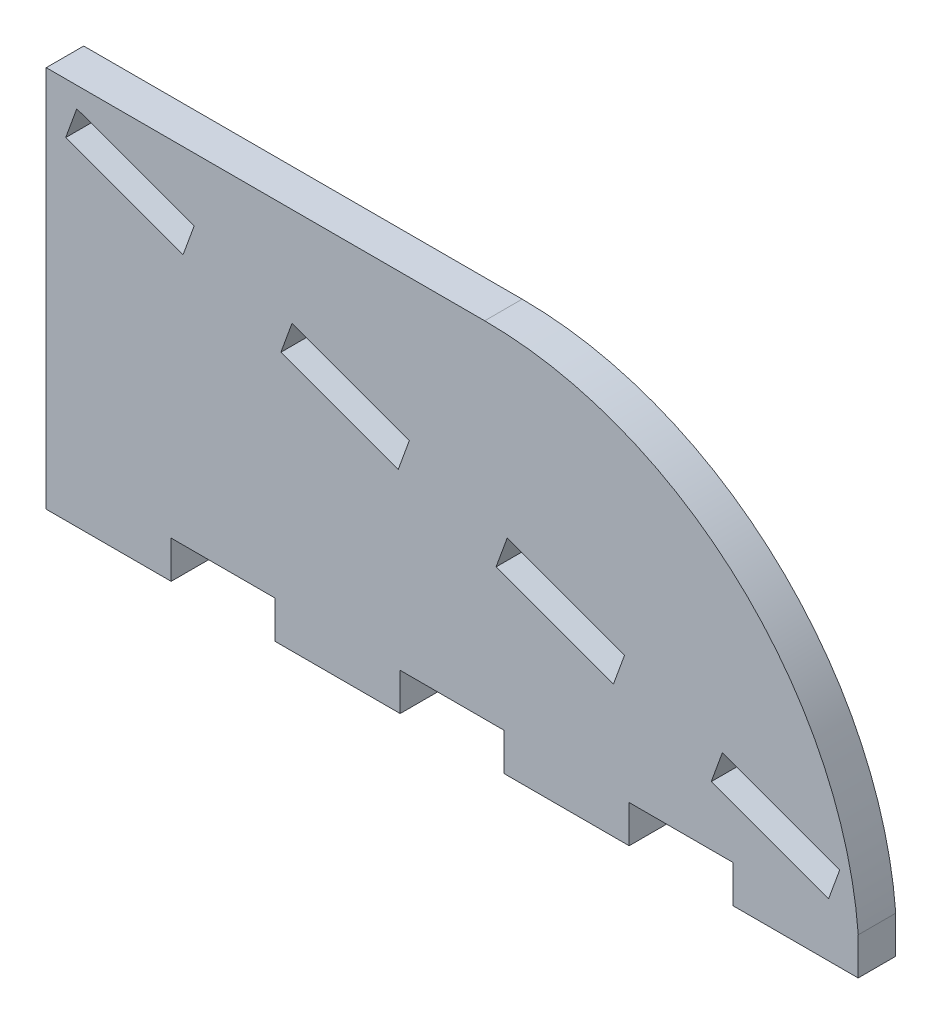
ISO-10303-21;
HEADER;
FILE_DESCRIPTION(('STEP AP214'),'2;1');
FILE_NAME('part.step','',(''),(''),'','','');
FILE_SCHEMA(('AUTOMOTIVE_DESIGN { 1 0 10303 214 1 1 1 1 }'));
ENDSEC;
DATA;
#1=APPLICATION_CONTEXT('core data for automotive mechanical design processes');
#2=APPLICATION_PROTOCOL_DEFINITION('international standard','automotive_design',2000,#1);
#3=PRODUCT_CONTEXT('',#1,'mechanical');
#4=PRODUCT('Part','Part','',(#3));
#5=PRODUCT_RELATED_PRODUCT_CATEGORY('part','',(#4));
#6=PRODUCT_DEFINITION_FORMATION('','',#4);
#7=PRODUCT_DEFINITION_CONTEXT('part definition',#1,'design');
#8=PRODUCT_DEFINITION('design','',#6,#7);
#9=PRODUCT_DEFINITION_SHAPE('','',#8);
#10=(LENGTH_UNIT() NAMED_UNIT(*) SI_UNIT(.MILLI.,.METRE.));
#11=(NAMED_UNIT(*) PLANE_ANGLE_UNIT() SI_UNIT($,.RADIAN.));
#12=(NAMED_UNIT(*) SI_UNIT($,.STERADIAN.) SOLID_ANGLE_UNIT());
#13=UNCERTAINTY_MEASURE_WITH_UNIT(LENGTH_MEASURE(1.E-05),#10,'distance_accuracy_value','');
#14=(GEOMETRIC_REPRESENTATION_CONTEXT(3) GLOBAL_UNCERTAINTY_ASSIGNED_CONTEXT((#13)) GLOBAL_UNIT_ASSIGNED_CONTEXT((#10,
#11,#12)) REPRESENTATION_CONTEXT('',''));
#15=CARTESIAN_POINT('',(0.,0.,0.));
#16=DIRECTION('',(0.,0.,1.));
#17=DIRECTION('',(1.,0.,0.));
#18=AXIS2_PLACEMENT_3D('',#15,#16,#17);
#19=CARTESIAN_POINT('',(0.,0.,3.));
#20=DIRECTION('',(0.,0.,-1.));
#21=DIRECTION('',(-1.,0.,0.));
#22=AXIS2_PLACEMENT_3D('',#19,#20,#21);
#23=PLANE('',#22);
#24=DIRECTION('',(-0.342020143325653,-0.939692620785914,0.));
#25=VECTOR('',#24,1.);
#26=CARTESIAN_POINT('',(-28.9958411960395,11.0002831121149,3.));
#27=LINE('',#26,#25);
#28=CARTESIAN_POINT('',(-28.1065888233928,13.4434839261583,3.));
#29=VERTEX_POINT('',#28);
#30=CARTESIAN_POINT('',(-28.9958411960395,11.0002831121149,3.));
#31=VERTEX_POINT('',#30);
#32=EDGE_CURVE('E294',#29,#31,#27,.T.);
#33=ORIENTED_EDGE('',*,*,#32,.F.);
#34=DIRECTION('',(-0.939692620785913,0.342020143325656,0.));
#35=VECTOR('',#34,1.);
#36=CARTESIAN_POINT('',(-28.1065888233928,13.4434839261583,3.));
#37=LINE('',#36,#35);
#38=CARTESIAN_POINT('',(-18.7096626155336,10.0232824929017,3.));
#39=VERTEX_POINT('',#38);
#40=EDGE_CURVE('E302',#39,#29,#37,.T.);
#41=ORIENTED_EDGE('',*,*,#40,.F.);
#42=DIRECTION('',(0.342020143325655,0.939692620785914,0.));
#43=VECTOR('',#42,1.);
#44=CARTESIAN_POINT('',(-18.7096626155336,10.0232824929017,3.));
#45=LINE('',#44,#43);
#46=CARTESIAN_POINT('',(-19.5989149881803,7.58008167885839,3.));
#47=VERTEX_POINT('',#46);
#48=EDGE_CURVE('E299',#47,#39,#45,.T.);
#49=ORIENTED_EDGE('',*,*,#48,.F.);
#50=DIRECTION('',(0.939692620785914,-0.342020143325653,0.));
#51=VECTOR('',#50,1.);
#52=CARTESIAN_POINT('',(-28.9958411960395,11.0002831121149,3.));
#53=LINE('',#52,#51);
#54=EDGE_CURVE('E296',#31,#47,#53,.T.);
#55=ORIENTED_EDGE('',*,*,#54,.F.);
#56=EDGE_LOOP('',(#33,#41,#49,#55));
#57=FACE_BOUND('',#56,.T.);
#58=DIRECTION('',(0.939692620785914,-0.342020143325653,0.));
#59=VECTOR('',#58,1.);
#60=CARTESIAN_POINT('',(-63.444972674051,23.5387415664335,3.));
#61=LINE('',#60,#59);
#62=CARTESIAN_POINT('',(-63.444972674051,23.5387415664335,3.));
#63=VERTEX_POINT('',#62);
#64=CARTESIAN_POINT('',(-54.0480464661919,20.118540133177,3.));
#65=VERTEX_POINT('',#64);
#66=EDGE_CURVE('E356',#63,#65,#61,.T.);
#67=ORIENTED_EDGE('',*,*,#66,.F.);
#68=DIRECTION('',(-0.342020143325653,-0.939692620785914,0.));
#69=VECTOR('',#68,1.);
#70=CARTESIAN_POINT('',(-63.444972674051,23.5387415664335,3.));
#71=LINE('',#70,#69);
#72=CARTESIAN_POINT('',(-62.5557203014043,25.9819423804769,3.));
#73=VERTEX_POINT('',#72);
#74=EDGE_CURVE('E364',#73,#63,#71,.T.);
#75=ORIENTED_EDGE('',*,*,#74,.F.);
#76=DIRECTION('',(-0.939692620785915,0.342020143325651,0.));
#77=VECTOR('',#76,1.);
#78=CARTESIAN_POINT('',(-62.5557203014043,25.9819423804769,3.));
#79=LINE('',#78,#77);
#80=CARTESIAN_POINT('',(-53.1587940935452,22.5617409472204,3.));
#81=VERTEX_POINT('',#80);
#82=EDGE_CURVE('E361',#81,#73,#79,.T.);
#83=ORIENTED_EDGE('',*,*,#82,.F.);
#84=DIRECTION('',(0.342020143325651,0.939692620785915,0.));
#85=VECTOR('',#84,1.);
#86=CARTESIAN_POINT('',(-53.1587940935452,22.5617409472204,3.));
#87=LINE('',#86,#85);
#88=EDGE_CURVE('E358',#65,#81,#87,.T.);
#89=ORIENTED_EDGE('',*,*,#88,.F.);
#90=EDGE_LOOP('',(#67,#75,#83,#89));
#91=FACE_BOUND('',#90,.T.);
#92=DIRECTION('',(1.,7.96020419445536E-13,0.));
#93=VECTOR('',#92,1.);
#94=CARTESIAN_POINT('',(0.,0.,3.));
#95=LINE('',#94,#93);
#96=CARTESIAN_POINT('',(-0.0100000000000031,0.,3.));
#97=VERTEX_POINT('',#96);
#98=CARTESIAN_POINT('',(0.,0.,3.));
#99=VERTEX_POINT('',#98);
#100=EDGE_CURVE('E420',#97,#99,#95,.T.);
#101=ORIENTED_EDGE('',*,*,#100,.T.);
#102=CARTESIAN_POINT('',(-29.9048115444083,-2.38793770719092,3.));
#103=DIRECTION('',(0.,0.,-1.));
#104=DIRECTION('',(-1.,0.,0.));
#105=AXIS2_PLACEMENT_3D('',#102,#103,#104);
#106=CIRCLE('',#105,30.);
#107=CARTESIAN_POINT('',(-29.9048115444083,27.6120622928091,3.));
#108=VERTEX_POINT('',#107);
#109=EDGE_CURVE('E11',#99,#108,#106,.F.);
#110=ORIENTED_EDGE('',*,*,#109,.T.);
#111=DIRECTION('',(-1.,0.,0.));
#112=VECTOR('',#111,1.);
#113=CARTESIAN_POINT('',(-65.,27.6120622928091,3.));
#114=LINE('',#113,#112);
#115=CARTESIAN_POINT('',(-65.,27.6120622928091,3.));
#116=VERTEX_POINT('',#115);
#117=EDGE_CURVE('E387',#108,#116,#114,.T.);
#118=ORIENTED_EDGE('',*,*,#117,.T.);
#119=DIRECTION('',(0.,-1.,0.));
#120=VECTOR('',#119,1.);
#121=CARTESIAN_POINT('',(-65.,0.,3.));
#122=LINE('',#121,#120);
#123=CARTESIAN_POINT('',(-65.,-3.00000000000001,3.));
#124=VERTEX_POINT('',#123);
#125=EDGE_CURVE('E389',#116,#124,#122,.T.);
#126=ORIENTED_EDGE('',*,*,#125,.T.);
#127=DIRECTION('',(1.,0.,0.));
#128=VECTOR('',#127,1.);
#129=CARTESIAN_POINT('',(-65.,-3.00000000000001,3.));
#130=LINE('',#129,#128);
#131=CARTESIAN_POINT('',(-55.,-3.00000000000001,3.));
#132=VERTEX_POINT('',#131);
#133=EDGE_CURVE('E392',#124,#132,#130,.T.);
#134=ORIENTED_EDGE('',*,*,#133,.T.);
#135=DIRECTION('',(0.,1.,0.));
#136=VECTOR('',#135,1.);
#137=CARTESIAN_POINT('',(-55.,0.,3.));
#138=LINE('',#137,#136);
#139=CARTESIAN_POINT('',(-55.,0.,3.));
#140=VERTEX_POINT('',#139);
#141=EDGE_CURVE('E394',#132,#140,#138,.T.);
#142=ORIENTED_EDGE('',*,*,#141,.T.);
#143=DIRECTION('',(1.,0.,0.));
#144=VECTOR('',#143,1.);
#145=CARTESIAN_POINT('',(-46.67,0.,3.));
#146=LINE('',#145,#144);
#147=CARTESIAN_POINT('',(-46.67,0.,3.));
#148=VERTEX_POINT('',#147);
#149=EDGE_CURVE('E396',#140,#148,#146,.T.);
#150=ORIENTED_EDGE('',*,*,#149,.T.);
#151=DIRECTION('',(0.,-1.,0.));
#152=VECTOR('',#151,1.);
#153=CARTESIAN_POINT('',(-46.67,0.,3.));
#154=LINE('',#153,#152);
#155=CARTESIAN_POINT('',(-46.67,-3.00000000000001,3.));
#156=VERTEX_POINT('',#155);
#157=EDGE_CURVE('E398',#148,#156,#154,.T.);
#158=ORIENTED_EDGE('',*,*,#157,.T.);
#159=DIRECTION('',(1.,0.,0.));
#160=VECTOR('',#159,1.);
#161=CARTESIAN_POINT('',(-46.67,-3.00000000000001,3.));
#162=LINE('',#161,#160);
#163=CARTESIAN_POINT('',(-36.67,-3.00000000000001,3.));
#164=VERTEX_POINT('',#163);
#165=EDGE_CURVE('E400',#156,#164,#162,.T.);
#166=ORIENTED_EDGE('',*,*,#165,.T.);
#167=DIRECTION('',(0.,1.,0.));
#168=VECTOR('',#167,1.);
#169=CARTESIAN_POINT('',(-36.67,0.,3.));
#170=LINE('',#169,#168);
#171=CARTESIAN_POINT('',(-36.67,0.,3.));
#172=VERTEX_POINT('',#171);
#173=EDGE_CURVE('E402',#164,#172,#170,.T.);
#174=ORIENTED_EDGE('',*,*,#173,.T.);
#175=DIRECTION('',(1.,0.,0.));
#176=VECTOR('',#175,1.);
#177=CARTESIAN_POINT('',(-28.34,0.,3.));
#178=LINE('',#177,#176);
#179=CARTESIAN_POINT('',(-28.34,0.,3.));
#180=VERTEX_POINT('',#179);
#181=EDGE_CURVE('E404',#172,#180,#178,.T.);
#182=ORIENTED_EDGE('',*,*,#181,.T.);
#183=DIRECTION('',(0.,-1.,0.));
#184=VECTOR('',#183,1.);
#185=CARTESIAN_POINT('',(-28.34,0.,3.));
#186=LINE('',#185,#184);
#187=CARTESIAN_POINT('',(-28.34,-3.00000000000001,3.));
#188=VERTEX_POINT('',#187);
#189=EDGE_CURVE('E406',#180,#188,#186,.T.);
#190=ORIENTED_EDGE('',*,*,#189,.T.);
#191=DIRECTION('',(1.,0.,0.));
#192=VECTOR('',#191,1.);
#193=CARTESIAN_POINT('',(-28.34,-3.00000000000001,3.));
#194=LINE('',#193,#192);
#195=CARTESIAN_POINT('',(-18.34,-3.00000000000001,3.));
#196=VERTEX_POINT('',#195);
#197=EDGE_CURVE('E408',#188,#196,#194,.T.);
#198=ORIENTED_EDGE('',*,*,#197,.T.);
#199=DIRECTION('',(0.,1.,0.));
#200=VECTOR('',#199,1.);
#201=CARTESIAN_POINT('',(-18.34,0.,3.));
#202=LINE('',#201,#200);
#203=CARTESIAN_POINT('',(-18.34,0.,3.));
#204=VERTEX_POINT('',#203);
#205=EDGE_CURVE('E410',#196,#204,#202,.T.);
#206=ORIENTED_EDGE('',*,*,#205,.T.);
#207=DIRECTION('',(1.,0.,0.));
#208=VECTOR('',#207,1.);
#209=CARTESIAN_POINT('',(-10.01,0.,3.));
#210=LINE('',#209,#208);
#211=CARTESIAN_POINT('',(-10.01,0.,3.));
#212=VERTEX_POINT('',#211);
#213=EDGE_CURVE('E412',#204,#212,#210,.T.);
#214=ORIENTED_EDGE('',*,*,#213,.T.);
#215=DIRECTION('',(0.,-1.,0.));
#216=VECTOR('',#215,1.);
#217=CARTESIAN_POINT('',(-10.01,0.,3.));
#218=LINE('',#217,#216);
#219=CARTESIAN_POINT('',(-10.01,-3.00000000000001,3.));
#220=VERTEX_POINT('',#219);
#221=EDGE_CURVE('E414',#212,#220,#218,.T.);
#222=ORIENTED_EDGE('',*,*,#221,.T.);
#223=DIRECTION('',(1.,0.,0.));
#224=VECTOR('',#223,1.);
#225=CARTESIAN_POINT('',(-10.01,-3.00000000000001,3.));
#226=LINE('',#225,#224);
#227=CARTESIAN_POINT('',(-0.0100000000000031,-3.00000000000001,3.));
#228=VERTEX_POINT('',#227);
#229=EDGE_CURVE('E416',#220,#228,#226,.T.);
#230=ORIENTED_EDGE('',*,*,#229,.T.);
#231=DIRECTION('',(0.,1.,0.));
#232=VECTOR('',#231,1.);
#233=CARTESIAN_POINT('',(-0.0100000000000031,0.,3.));
#234=LINE('',#233,#232);
#235=EDGE_CURVE('E418',#228,#97,#234,.T.);
#236=ORIENTED_EDGE('',*,*,#235,.T.);
#237=EDGE_LOOP('',(#101,#110,#118,#126,#134,#142,#150,#158,#166,#174,#182,#190,#198,#206,#214,
#222,#230,#236));
#238=FACE_BOUND('',#237,.T.);
#239=DIRECTION('',(-0.342020143325653,-0.939692620785914,0.));
#240=VECTOR('',#239,1.);
#241=CARTESIAN_POINT('',(-46.2204069350453,17.2695123392742,3.));
#242=LINE('',#241,#240);
#243=CARTESIAN_POINT('',(-45.3311545623986,19.7127131533176,3.));
#244=VERTEX_POINT('',#243);
#245=CARTESIAN_POINT('',(-46.2204069350453,17.2695123392742,3.));
#246=VERTEX_POINT('',#245);
#247=EDGE_CURVE('E325',#244,#246,#242,.T.);
#248=ORIENTED_EDGE('',*,*,#247,.F.);
#249=DIRECTION('',(-0.939692620785913,0.342020143325656,0.));
#250=VECTOR('',#249,1.);
#251=CARTESIAN_POINT('',(-45.3311545623986,19.7127131533176,3.));
#252=LINE('',#251,#250);
#253=CARTESIAN_POINT('',(-35.9342283545394,16.292511720061,3.));
#254=VERTEX_POINT('',#253);
#255=EDGE_CURVE('E333',#254,#244,#252,.T.);
#256=ORIENTED_EDGE('',*,*,#255,.F.);
#257=DIRECTION('',(0.342020143325657,0.939692620785913,0.));
#258=VECTOR('',#257,1.);
#259=CARTESIAN_POINT('',(-35.9342283545394,16.292511720061,3.));
#260=LINE('',#259,#258);
#261=CARTESIAN_POINT('',(-36.8234807271861,13.8493109060177,3.));
#262=VERTEX_POINT('',#261);
#263=EDGE_CURVE('E330',#262,#254,#260,.T.);
#264=ORIENTED_EDGE('',*,*,#263,.F.);
#265=DIRECTION('',(0.939692620785914,-0.342020143325653,0.));
#266=VECTOR('',#265,1.);
#267=CARTESIAN_POINT('',(-46.2204069350453,17.2695123392742,3.));
#268=LINE('',#267,#266);
#269=EDGE_CURVE('E327',#246,#262,#268,.T.);
#270=ORIENTED_EDGE('',*,*,#269,.F.);
#271=EDGE_LOOP('',(#248,#256,#264,#270));
#272=FACE_BOUND('',#271,.T.);
#273=DIRECTION('',(-0.342020143325653,-0.939692620785914,0.));
#274=VECTOR('',#273,1.);
#275=CARTESIAN_POINT('',(-11.7712754570337,4.73105388495563,3.));
#276=LINE('',#275,#274);
#277=CARTESIAN_POINT('',(-10.882023084387,7.17425469899901,3.));
#278=VERTEX_POINT('',#277);
#279=CARTESIAN_POINT('',(-11.7712754570337,4.73105388495563,3.));
#280=VERTEX_POINT('',#279);
#281=EDGE_CURVE('E253',#278,#280,#276,.T.);
#282=ORIENTED_EDGE('',*,*,#281,.F.);
#283=DIRECTION('',(-0.939692620785913,0.342020143325656,0.));
#284=VECTOR('',#283,1.);
#285=CARTESIAN_POINT('',(-10.882023084387,7.17425469899901,3.));
#286=LINE('',#285,#284);
#287=CARTESIAN_POINT('',(-1.48509687652787,3.75405326574244,3.));
#288=VERTEX_POINT('',#287);
#289=EDGE_CURVE('E278',#288,#278,#286,.T.);
#290=ORIENTED_EDGE('',*,*,#289,.F.);
#291=DIRECTION('',(0.342020143325655,0.939692620785914,0.));
#292=VECTOR('',#291,1.);
#293=CARTESIAN_POINT('',(-1.48509687652787,3.75405326574244,3.));
#294=LINE('',#293,#292);
#295=CARTESIAN_POINT('',(-2.37434924917456,1.3108524516991,3.));
#296=VERTEX_POINT('',#295);
#297=EDGE_CURVE('E276',#296,#288,#294,.T.);
#298=ORIENTED_EDGE('',*,*,#297,.F.);
#299=DIRECTION('',(0.939692620785914,-0.342020143325653,0.));
#300=VECTOR('',#299,1.);
#301=CARTESIAN_POINT('',(-11.7712754570337,4.73105388495563,3.));
#302=LINE('',#301,#300);
#303=EDGE_CURVE('E263',#280,#296,#302,.T.);
#304=ORIENTED_EDGE('',*,*,#303,.F.);
#305=EDGE_LOOP('',(#282,#290,#298,#304));
#306=FACE_BOUND('',#305,.T.);
#307=ADVANCED_FACE('F33',(#57,#91,#238,#272,#306),#23,.F.);
#308=CARTESIAN_POINT('',(0.,0.,0.));
#309=DIRECTION('',(0.,0.,-1.));
#310=DIRECTION('',(-1.,0.,0.));
#311=AXIS2_PLACEMENT_3D('',#308,#309,#310);
#312=PLANE('',#311);
#313=DIRECTION('',(-0.939692620785913,0.342020143325656,0.));
#314=VECTOR('',#313,1.);
#315=CARTESIAN_POINT('',(-28.1065888233928,13.4434839261583,0.));
#316=LINE('',#315,#314);
#317=CARTESIAN_POINT('',(-18.7096626155336,10.0232824929017,0.));
#318=VERTEX_POINT('',#317);
#319=CARTESIAN_POINT('',(-28.1065888233928,13.4434839261583,0.));
#320=VERTEX_POINT('',#319);
#321=EDGE_CURVE('E297',#318,#320,#316,.T.);
#322=ORIENTED_EDGE('',*,*,#321,.T.);
#323=DIRECTION('',(-0.342020143325653,-0.939692620785914,0.));
#324=VECTOR('',#323,1.);
#325=CARTESIAN_POINT('',(-28.9958411960395,11.0002831121149,0.));
#326=LINE('',#325,#324);
#327=CARTESIAN_POINT('',(-28.9958411960395,11.0002831121149,0.));
#328=VERTEX_POINT('',#327);
#329=EDGE_CURVE('E271',#320,#328,#326,.T.);
#330=ORIENTED_EDGE('',*,*,#329,.T.);
#331=DIRECTION('',(0.939692620785914,-0.342020143325653,0.));
#332=VECTOR('',#331,1.);
#333=CARTESIAN_POINT('',(-28.9958411960395,11.0002831121149,0.));
#334=LINE('',#333,#332);
#335=CARTESIAN_POINT('',(-19.5989149881803,7.58008167885839,0.));
#336=VERTEX_POINT('',#335);
#337=EDGE_CURVE('E307',#328,#336,#334,.T.);
#338=ORIENTED_EDGE('',*,*,#337,.T.);
#339=DIRECTION('',(0.342020143325655,0.939692620785914,0.));
#340=VECTOR('',#339,1.);
#341=CARTESIAN_POINT('',(-18.7096626155336,10.0232824929017,0.));
#342=LINE('',#341,#340);
#343=EDGE_CURVE('E310',#336,#318,#342,.T.);
#344=ORIENTED_EDGE('',*,*,#343,.T.);
#345=EDGE_LOOP('',(#322,#330,#338,#344));
#346=FACE_BOUND('',#345,.T.);
#347=DIRECTION('',(-0.342020143325653,-0.939692620785914,0.));
#348=VECTOR('',#347,1.);
#349=CARTESIAN_POINT('',(-63.444972674051,23.5387415664335,0.));
#350=LINE('',#349,#348);
#351=CARTESIAN_POINT('',(-62.5557203014043,25.9819423804769,0.));
#352=VERTEX_POINT('',#351);
#353=CARTESIAN_POINT('',(-63.444972674051,23.5387415664335,0.));
#354=VERTEX_POINT('',#353);
#355=EDGE_CURVE('E359',#352,#354,#350,.T.);
#356=ORIENTED_EDGE('',*,*,#355,.T.);
#357=DIRECTION('',(0.939692620785914,-0.342020143325653,0.));
#358=VECTOR('',#357,1.);
#359=CARTESIAN_POINT('',(-63.444972674051,23.5387415664335,0.));
#360=LINE('',#359,#358);
#361=CARTESIAN_POINT('',(-54.0480464661919,20.118540133177,0.));
#362=VERTEX_POINT('',#361);
#363=EDGE_CURVE('E355',#354,#362,#360,.T.);
#364=ORIENTED_EDGE('',*,*,#363,.T.);
#365=DIRECTION('',(0.342020143325651,0.939692620785915,0.));
#366=VECTOR('',#365,1.);
#367=CARTESIAN_POINT('',(-53.1587940935452,22.5617409472204,0.));
#368=LINE('',#367,#366);
#369=CARTESIAN_POINT('',(-53.1587940935452,22.5617409472204,0.));
#370=VERTEX_POINT('',#369);
#371=EDGE_CURVE('E369',#362,#370,#368,.T.);
#372=ORIENTED_EDGE('',*,*,#371,.T.);
#373=DIRECTION('',(-0.939692620785915,0.342020143325651,0.));
#374=VECTOR('',#373,1.);
#375=CARTESIAN_POINT('',(-62.5557203014043,25.9819423804769,0.));
#376=LINE('',#375,#374);
#377=EDGE_CURVE('E372',#370,#352,#376,.T.);
#378=ORIENTED_EDGE('',*,*,#377,.T.);
#379=EDGE_LOOP('',(#356,#364,#372,#378));
#380=FACE_BOUND('',#379,.T.);
#381=DIRECTION('',(-1.,0.,0.));
#382=VECTOR('',#381,1.);
#383=CARTESIAN_POINT('',(-65.,27.6120622928091,0.));
#384=LINE('',#383,#382);
#385=CARTESIAN_POINT('',(-29.9048115444083,27.6120622928091,0.));
#386=VERTEX_POINT('',#385);
#387=CARTESIAN_POINT('',(-65.,27.6120622928091,0.));
#388=VERTEX_POINT('',#387);
#389=EDGE_CURVE('E386',#386,#388,#384,.T.);
#390=ORIENTED_EDGE('',*,*,#389,.F.);
#391=CARTESIAN_POINT('',(-29.9048115444083,-2.38793770719092,0.));
#392=DIRECTION('',(0.,0.,-1.));
#393=DIRECTION('',(-1.,0.,0.));
#394=AXIS2_PLACEMENT_3D('',#391,#392,#393);
#395=CIRCLE('',#394,30.);
#396=CARTESIAN_POINT('',(0.,0.,0.));
#397=VERTEX_POINT('',#396);
#398=EDGE_CURVE('E41',#386,#397,#395,.T.);
#399=ORIENTED_EDGE('',*,*,#398,.T.);
#400=DIRECTION('',(1.,7.96020419445536E-13,0.));
#401=VECTOR('',#400,1.);
#402=CARTESIAN_POINT('',(0.,0.,0.));
#403=LINE('',#402,#401);
#404=CARTESIAN_POINT('',(-0.0100000000000031,0.,0.));
#405=VERTEX_POINT('',#404);
#406=EDGE_CURVE('E390',#405,#397,#403,.T.);
#407=ORIENTED_EDGE('',*,*,#406,.F.);
#408=DIRECTION('',(0.,1.,0.));
#409=VECTOR('',#408,1.);
#410=CARTESIAN_POINT('',(-0.0100000000000031,0.,0.));
#411=LINE('',#410,#409);
#412=CARTESIAN_POINT('',(-0.0100000000000031,-3.00000000000001,0.));
#413=VERTEX_POINT('',#412);
#414=EDGE_CURVE('E452',#413,#405,#411,.T.);
#415=ORIENTED_EDGE('',*,*,#414,.F.);
#416=DIRECTION('',(1.,0.,0.));
#417=VECTOR('',#416,1.);
#418=CARTESIAN_POINT('',(-10.01,-3.00000000000001,0.));
#419=LINE('',#418,#417);
#420=CARTESIAN_POINT('',(-10.01,-3.00000000000001,0.));
#421=VERTEX_POINT('',#420);
#422=EDGE_CURVE('E450',#421,#413,#419,.T.);
#423=ORIENTED_EDGE('',*,*,#422,.F.);
#424=DIRECTION('',(0.,-1.,0.));
#425=VECTOR('',#424,1.);
#426=CARTESIAN_POINT('',(-10.01,0.,0.));
#427=LINE('',#426,#425);
#428=CARTESIAN_POINT('',(-10.01,0.,0.));
#429=VERTEX_POINT('',#428);
#430=EDGE_CURVE('E448',#429,#421,#427,.T.);
#431=ORIENTED_EDGE('',*,*,#430,.F.);
#432=DIRECTION('',(1.,0.,0.));
#433=VECTOR('',#432,1.);
#434=CARTESIAN_POINT('',(-10.01,0.,0.));
#435=LINE('',#434,#433);
#436=CARTESIAN_POINT('',(-18.34,0.,0.));
#437=VERTEX_POINT('',#436);
#438=EDGE_CURVE('E446',#437,#429,#435,.T.);
#439=ORIENTED_EDGE('',*,*,#438,.F.);
#440=DIRECTION('',(0.,1.,0.));
#441=VECTOR('',#440,1.);
#442=CARTESIAN_POINT('',(-18.34,0.,0.));
#443=LINE('',#442,#441);
#444=CARTESIAN_POINT('',(-18.34,-3.00000000000001,0.));
#445=VERTEX_POINT('',#444);
#446=EDGE_CURVE('E444',#445,#437,#443,.T.);
#447=ORIENTED_EDGE('',*,*,#446,.F.);
#448=DIRECTION('',(1.,0.,0.));
#449=VECTOR('',#448,1.);
#450=CARTESIAN_POINT('',(-28.34,-3.00000000000001,0.));
#451=LINE('',#450,#449);
#452=CARTESIAN_POINT('',(-28.34,-3.00000000000001,0.));
#453=VERTEX_POINT('',#452);
#454=EDGE_CURVE('E442',#453,#445,#451,.T.);
#455=ORIENTED_EDGE('',*,*,#454,.F.);
#456=DIRECTION('',(0.,-1.,0.));
#457=VECTOR('',#456,1.);
#458=CARTESIAN_POINT('',(-28.34,0.,0.));
#459=LINE('',#458,#457);
#460=CARTESIAN_POINT('',(-28.34,0.,0.));
#461=VERTEX_POINT('',#460);
#462=EDGE_CURVE('E440',#461,#453,#459,.T.);
#463=ORIENTED_EDGE('',*,*,#462,.F.);
#464=DIRECTION('',(1.,0.,0.));
#465=VECTOR('',#464,1.);
#466=CARTESIAN_POINT('',(-28.34,0.,0.));
#467=LINE('',#466,#465);
#468=CARTESIAN_POINT('',(-36.67,0.,0.));
#469=VERTEX_POINT('',#468);
#470=EDGE_CURVE('E438',#469,#461,#467,.T.);
#471=ORIENTED_EDGE('',*,*,#470,.F.);
#472=DIRECTION('',(0.,1.,0.));
#473=VECTOR('',#472,1.);
#474=CARTESIAN_POINT('',(-36.67,0.,0.));
#475=LINE('',#474,#473);
#476=CARTESIAN_POINT('',(-36.67,-3.00000000000001,0.));
#477=VERTEX_POINT('',#476);
#478=EDGE_CURVE('E436',#477,#469,#475,.T.);
#479=ORIENTED_EDGE('',*,*,#478,.F.);
#480=DIRECTION('',(1.,0.,0.));
#481=VECTOR('',#480,1.);
#482=CARTESIAN_POINT('',(-46.67,-3.00000000000001,0.));
#483=LINE('',#482,#481);
#484=CARTESIAN_POINT('',(-46.67,-3.00000000000001,0.));
#485=VERTEX_POINT('',#484);
#486=EDGE_CURVE('E434',#485,#477,#483,.T.);
#487=ORIENTED_EDGE('',*,*,#486,.F.);
#488=DIRECTION('',(0.,-1.,0.));
#489=VECTOR('',#488,1.);
#490=CARTESIAN_POINT('',(-46.67,0.,0.));
#491=LINE('',#490,#489);
#492=CARTESIAN_POINT('',(-46.67,0.,0.));
#493=VERTEX_POINT('',#492);
#494=EDGE_CURVE('E432',#493,#485,#491,.T.);
#495=ORIENTED_EDGE('',*,*,#494,.F.);
#496=DIRECTION('',(1.,0.,0.));
#497=VECTOR('',#496,1.);
#498=CARTESIAN_POINT('',(-46.67,0.,0.));
#499=LINE('',#498,#497);
#500=CARTESIAN_POINT('',(-55.,0.,0.));
#501=VERTEX_POINT('',#500);
#502=EDGE_CURVE('E430',#501,#493,#499,.T.);
#503=ORIENTED_EDGE('',*,*,#502,.F.);
#504=DIRECTION('',(0.,1.,0.));
#505=VECTOR('',#504,1.);
#506=CARTESIAN_POINT('',(-55.,0.,0.));
#507=LINE('',#506,#505);
#508=CARTESIAN_POINT('',(-55.,-3.00000000000001,0.));
#509=VERTEX_POINT('',#508);
#510=EDGE_CURVE('E428',#509,#501,#507,.T.);
#511=ORIENTED_EDGE('',*,*,#510,.F.);
#512=DIRECTION('',(1.,0.,0.));
#513=VECTOR('',#512,1.);
#514=CARTESIAN_POINT('',(-65.,-3.00000000000001,0.));
#515=LINE('',#514,#513);
#516=CARTESIAN_POINT('',(-65.,-3.00000000000001,0.));
#517=VERTEX_POINT('',#516);
#518=EDGE_CURVE('E426',#517,#509,#515,.T.);
#519=ORIENTED_EDGE('',*,*,#518,.F.);
#520=DIRECTION('',(0.,-1.,0.));
#521=VECTOR('',#520,1.);
#522=CARTESIAN_POINT('',(-65.,0.,0.));
#523=LINE('',#522,#521);
#524=EDGE_CURVE('E424',#388,#517,#523,.T.);
#525=ORIENTED_EDGE('',*,*,#524,.F.);
#526=EDGE_LOOP('',(#390,#399,#407,#415,#423,#431,#439,#447,#455,#463,#471,#479,#487,#495,#503,
#511,#519,#525));
#527=FACE_BOUND('',#526,.T.);
#528=DIRECTION('',(-0.939692620785913,0.342020143325656,0.));
#529=VECTOR('',#528,1.);
#530=CARTESIAN_POINT('',(-45.3311545623986,19.7127131533176,0.));
#531=LINE('',#530,#529);
#532=CARTESIAN_POINT('',(-35.9342283545394,16.292511720061,0.));
#533=VERTEX_POINT('',#532);
#534=CARTESIAN_POINT('',(-45.3311545623986,19.7127131533176,0.));
#535=VERTEX_POINT('',#534);
#536=EDGE_CURVE('E328',#533,#535,#531,.T.);
#537=ORIENTED_EDGE('',*,*,#536,.T.);
#538=DIRECTION('',(-0.342020143325653,-0.939692620785914,0.));
#539=VECTOR('',#538,1.);
#540=CARTESIAN_POINT('',(-46.2204069350453,17.2695123392742,0.));
#541=LINE('',#540,#539);
#542=CARTESIAN_POINT('',(-46.2204069350453,17.2695123392742,0.));
#543=VERTEX_POINT('',#542);
#544=EDGE_CURVE('E324',#535,#543,#541,.T.);
#545=ORIENTED_EDGE('',*,*,#544,.T.);
#546=DIRECTION('',(0.939692620785914,-0.342020143325653,0.));
#547=VECTOR('',#546,1.);
#548=CARTESIAN_POINT('',(-46.2204069350453,17.2695123392742,0.));
#549=LINE('',#548,#547);
#550=CARTESIAN_POINT('',(-36.8234807271861,13.8493109060177,0.));
#551=VERTEX_POINT('',#550);
#552=EDGE_CURVE('E338',#543,#551,#549,.T.);
#553=ORIENTED_EDGE('',*,*,#552,.T.);
#554=DIRECTION('',(0.342020143325657,0.939692620785913,0.));
#555=VECTOR('',#554,1.);
#556=CARTESIAN_POINT('',(-35.9342283545394,16.292511720061,0.));
#557=LINE('',#556,#555);
#558=EDGE_CURVE('E341',#551,#533,#557,.T.);
#559=ORIENTED_EDGE('',*,*,#558,.T.);
#560=EDGE_LOOP('',(#537,#545,#553,#559));
#561=FACE_BOUND('',#560,.T.);
#562=DIRECTION('',(-0.939692620785913,0.342020143325656,0.));
#563=VECTOR('',#562,1.);
#564=CARTESIAN_POINT('',(-10.882023084387,7.17425469899901,0.));
#565=LINE('',#564,#563);
#566=CARTESIAN_POINT('',(-1.48509687652787,3.75405326574244,0.));
#567=VERTEX_POINT('',#566);
#568=CARTESIAN_POINT('',(-10.882023084387,7.17425469899901,0.));
#569=VERTEX_POINT('',#568);
#570=EDGE_CURVE('E264',#567,#569,#565,.T.);
#571=ORIENTED_EDGE('',*,*,#570,.T.);
#572=DIRECTION('',(-0.342020143325653,-0.939692620785914,0.));
#573=VECTOR('',#572,1.);
#574=CARTESIAN_POINT('',(-11.7712754570337,4.73105388495563,0.));
#575=LINE('',#574,#573);
#576=CARTESIAN_POINT('',(-11.7712754570337,4.73105388495563,0.));
#577=VERTEX_POINT('',#576);
#578=EDGE_CURVE('E282',#569,#577,#575,.T.);
#579=ORIENTED_EDGE('',*,*,#578,.T.);
#580=DIRECTION('',(0.939692620785914,-0.342020143325653,0.));
#581=VECTOR('',#580,1.);
#582=CARTESIAN_POINT('',(-11.7712754570337,4.73105388495563,0.));
#583=LINE('',#582,#581);
#584=CARTESIAN_POINT('',(-2.37434924917456,1.3108524516991,0.));
#585=VERTEX_POINT('',#584);
#586=EDGE_CURVE('E270',#577,#585,#583,.T.);
#587=ORIENTED_EDGE('',*,*,#586,.T.);
#588=DIRECTION('',(0.342020143325655,0.939692620785914,0.));
#589=VECTOR('',#588,1.);
#590=CARTESIAN_POINT('',(-1.48509687652787,3.75405326574244,0.));
#591=LINE('',#590,#589);
#592=EDGE_CURVE('E285',#585,#567,#591,.T.);
#593=ORIENTED_EDGE('',*,*,#592,.T.);
#594=EDGE_LOOP('',(#571,#579,#587,#593));
#595=FACE_BOUND('',#594,.T.);
#596=ADVANCED_FACE('F509',(#346,#380,#527,#561,#595),#312,.T.);
#597=CARTESIAN_POINT('',(-65.,27.6120622928091,3.));
#598=DIRECTION('',(0.,-1.,0.));
#599=DIRECTION('',(0.,0.,-1.));
#600=AXIS2_PLACEMENT_3D('',#597,#598,#599);
#601=PLANE('',#600);
#602=ORIENTED_EDGE('',*,*,#117,.F.);
#603=DIRECTION('',(0.,0.,-1.));
#604=VECTOR('',#603,1.);
#605=CARTESIAN_POINT('',(-29.9048115444083,27.6120622928091,3.));
#606=LINE('',#605,#604);
#607=EDGE_CURVE('E505',#108,#386,#606,.T.);
#608=ORIENTED_EDGE('',*,*,#607,.T.);
#609=ORIENTED_EDGE('',*,*,#389,.T.);
#610=DIRECTION('',(0.,0.,-1.));
#611=VECTOR('',#610,1.);
#612=CARTESIAN_POINT('',(-65.,27.6120622928091,3.));
#613=LINE('',#612,#611);
#614=EDGE_CURVE('E502',#116,#388,#613,.T.);
#615=ORIENTED_EDGE('',*,*,#614,.F.);
#616=EDGE_LOOP('',(#602,#608,#609,#615));
#617=FACE_BOUND('',#616,.T.);
#618=ADVANCED_FACE('F519',(#617),#601,.F.);
#619=CARTESIAN_POINT('',(-65.,0.,3.));
#620=DIRECTION('',(1.,0.,0.));
#621=DIRECTION('',(0.,0.,-1.));
#622=AXIS2_PLACEMENT_3D('',#619,#620,#621);
#623=PLANE('',#622);
#624=ORIENTED_EDGE('',*,*,#524,.T.);
#625=DIRECTION('',(0.,0.,-1.));
#626=VECTOR('',#625,1.);
#627=CARTESIAN_POINT('',(-65.,-3.00000000000001,3.));
#628=LINE('',#627,#626);
#629=EDGE_CURVE('E499',#124,#517,#628,.T.);
#630=ORIENTED_EDGE('',*,*,#629,.F.);
#631=ORIENTED_EDGE('',*,*,#125,.F.);
#632=ORIENTED_EDGE('',*,*,#614,.T.);
#633=EDGE_LOOP('',(#624,#630,#631,#632));
#634=FACE_BOUND('',#633,.T.);
#635=ADVANCED_FACE('F527',(#634),#623,.F.);
#636=CARTESIAN_POINT('',(-65.,-3.00000000000001,3.));
#637=DIRECTION('',(0.,1.,0.));
#638=DIRECTION('',(0.,0.,1.));
#639=AXIS2_PLACEMENT_3D('',#636,#637,#638);
#640=PLANE('',#639);
#641=ORIENTED_EDGE('',*,*,#518,.T.);
#642=DIRECTION('',(0.,0.,-1.));
#643=VECTOR('',#642,1.);
#644=CARTESIAN_POINT('',(-55.,-3.00000000000001,3.));
#645=LINE('',#644,#643);
#646=EDGE_CURVE('E496',#132,#509,#645,.T.);
#647=ORIENTED_EDGE('',*,*,#646,.F.);
#648=ORIENTED_EDGE('',*,*,#133,.F.);
#649=ORIENTED_EDGE('',*,*,#629,.T.);
#650=EDGE_LOOP('',(#641,#647,#648,#649));
#651=FACE_BOUND('',#650,.T.);
#652=ADVANCED_FACE('F530',(#651),#640,.F.);
#653=CARTESIAN_POINT('',(-55.,0.,3.));
#654=DIRECTION('',(-1.,0.,0.));
#655=DIRECTION('',(0.,0.,1.));
#656=AXIS2_PLACEMENT_3D('',#653,#654,#655);
#657=PLANE('',#656);
#658=ORIENTED_EDGE('',*,*,#510,.T.);
#659=DIRECTION('',(0.,0.,-1.));
#660=VECTOR('',#659,1.);
#661=CARTESIAN_POINT('',(-55.,0.,3.));
#662=LINE('',#661,#660);
#663=EDGE_CURVE('E493',#140,#501,#662,.T.);
#664=ORIENTED_EDGE('',*,*,#663,.F.);
#665=ORIENTED_EDGE('',*,*,#141,.F.);
#666=ORIENTED_EDGE('',*,*,#646,.T.);
#667=EDGE_LOOP('',(#658,#664,#665,#666));
#668=FACE_BOUND('',#667,.T.);
#669=ADVANCED_FACE('F535',(#668),#657,.F.);
#670=CARTESIAN_POINT('',(-46.67,0.,3.));
#671=DIRECTION('',(0.,1.,0.));
#672=DIRECTION('',(-1.,0.,0.));
#673=AXIS2_PLACEMENT_3D('',#670,#671,#672);
#674=PLANE('',#673);
#675=ORIENTED_EDGE('',*,*,#502,.T.);
#676=DIRECTION('',(0.,0.,-1.));
#677=VECTOR('',#676,1.);
#678=CARTESIAN_POINT('',(-46.67,0.,3.));
#679=LINE('',#678,#677);
#680=EDGE_CURVE('E490',#148,#493,#679,.T.);
#681=ORIENTED_EDGE('',*,*,#680,.F.);
#682=ORIENTED_EDGE('',*,*,#149,.F.);
#683=ORIENTED_EDGE('',*,*,#663,.T.);
#684=EDGE_LOOP('',(#675,#681,#682,#683));
#685=FACE_BOUND('',#684,.T.);
#686=ADVANCED_FACE('F541',(#685),#674,.F.);
#687=CARTESIAN_POINT('',(-46.67,0.,3.));
#688=DIRECTION('',(1.,0.,0.));
#689=DIRECTION('',(0.,0.,-1.));
#690=AXIS2_PLACEMENT_3D('',#687,#688,#689);
#691=PLANE('',#690);
#692=ORIENTED_EDGE('',*,*,#494,.T.);
#693=DIRECTION('',(0.,0.,-1.));
#694=VECTOR('',#693,1.);
#695=CARTESIAN_POINT('',(-46.67,-3.00000000000001,3.));
#696=LINE('',#695,#694);
#697=EDGE_CURVE('E487',#156,#485,#696,.T.);
#698=ORIENTED_EDGE('',*,*,#697,.F.);
#699=ORIENTED_EDGE('',*,*,#157,.F.);
#700=ORIENTED_EDGE('',*,*,#680,.T.);
#701=EDGE_LOOP('',(#692,#698,#699,#700));
#702=FACE_BOUND('',#701,.T.);
#703=ADVANCED_FACE('F545',(#702),#691,.F.);
#704=CARTESIAN_POINT('',(-46.67,-3.00000000000001,3.));
#705=DIRECTION('',(0.,1.,0.));
#706=DIRECTION('',(0.,0.,1.));
#707=AXIS2_PLACEMENT_3D('',#704,#705,#706);
#708=PLANE('',#707);
#709=ORIENTED_EDGE('',*,*,#486,.T.);
#710=DIRECTION('',(0.,0.,-1.));
#711=VECTOR('',#710,1.);
#712=CARTESIAN_POINT('',(-36.67,-3.00000000000001,3.));
#713=LINE('',#712,#711);
#714=EDGE_CURVE('E484',#164,#477,#713,.T.);
#715=ORIENTED_EDGE('',*,*,#714,.F.);
#716=ORIENTED_EDGE('',*,*,#165,.F.);
#717=ORIENTED_EDGE('',*,*,#697,.T.);
#718=EDGE_LOOP('',(#709,#715,#716,#717));
#719=FACE_BOUND('',#718,.T.);
#720=ADVANCED_FACE('F550',(#719),#708,.F.);
#721=CARTESIAN_POINT('',(-36.67,0.,3.));
#722=DIRECTION('',(-1.,0.,0.));
#723=DIRECTION('',(0.,0.,1.));
#724=AXIS2_PLACEMENT_3D('',#721,#722,#723);
#725=PLANE('',#724);
#726=ORIENTED_EDGE('',*,*,#478,.T.);
#727=DIRECTION('',(0.,0.,-1.));
#728=VECTOR('',#727,1.);
#729=CARTESIAN_POINT('',(-36.67,0.,3.));
#730=LINE('',#729,#728);
#731=EDGE_CURVE('E481',#172,#469,#730,.T.);
#732=ORIENTED_EDGE('',*,*,#731,.F.);
#733=ORIENTED_EDGE('',*,*,#173,.F.);
#734=ORIENTED_EDGE('',*,*,#714,.T.);
#735=EDGE_LOOP('',(#726,#732,#733,#734));
#736=FACE_BOUND('',#735,.T.);
#737=ADVANCED_FACE('F556',(#736),#725,.F.);
#738=CARTESIAN_POINT('',(-28.34,0.,3.));
#739=DIRECTION('',(0.,1.,0.));
#740=DIRECTION('',(-1.,0.,0.));
#741=AXIS2_PLACEMENT_3D('',#738,#739,#740);
#742=PLANE('',#741);
#743=ORIENTED_EDGE('',*,*,#470,.T.);
#744=DIRECTION('',(0.,0.,-1.));
#745=VECTOR('',#744,1.);
#746=CARTESIAN_POINT('',(-28.34,0.,3.));
#747=LINE('',#746,#745);
#748=EDGE_CURVE('E478',#180,#461,#747,.T.);
#749=ORIENTED_EDGE('',*,*,#748,.F.);
#750=ORIENTED_EDGE('',*,*,#181,.F.);
#751=ORIENTED_EDGE('',*,*,#731,.T.);
#752=EDGE_LOOP('',(#743,#749,#750,#751));
#753=FACE_BOUND('',#752,.T.);
#754=ADVANCED_FACE('F560',(#753),#742,.F.);
#755=CARTESIAN_POINT('',(-28.34,0.,3.));
#756=DIRECTION('',(1.,0.,0.));
#757=DIRECTION('',(0.,0.,-1.));
#758=AXIS2_PLACEMENT_3D('',#755,#756,#757);
#759=PLANE('',#758);
#760=ORIENTED_EDGE('',*,*,#462,.T.);
#761=DIRECTION('',(0.,0.,-1.));
#762=VECTOR('',#761,1.);
#763=CARTESIAN_POINT('',(-28.34,-3.00000000000001,3.));
#764=LINE('',#763,#762);
#765=EDGE_CURVE('E475',#188,#453,#764,.T.);
#766=ORIENTED_EDGE('',*,*,#765,.F.);
#767=ORIENTED_EDGE('',*,*,#189,.F.);
#768=ORIENTED_EDGE('',*,*,#748,.T.);
#769=EDGE_LOOP('',(#760,#766,#767,#768));
#770=FACE_BOUND('',#769,.T.);
#771=ADVANCED_FACE('F565',(#770),#759,.F.);
#772=CARTESIAN_POINT('',(-28.34,-3.00000000000001,3.));
#773=DIRECTION('',(0.,1.,0.));
#774=DIRECTION('',(0.,0.,1.));
#775=AXIS2_PLACEMENT_3D('',#772,#773,#774);
#776=PLANE('',#775);
#777=ORIENTED_EDGE('',*,*,#454,.T.);
#778=DIRECTION('',(0.,0.,-1.));
#779=VECTOR('',#778,1.);
#780=CARTESIAN_POINT('',(-18.34,-3.00000000000001,3.));
#781=LINE('',#780,#779);
#782=EDGE_CURVE('E472',#196,#445,#781,.T.);
#783=ORIENTED_EDGE('',*,*,#782,.F.);
#784=ORIENTED_EDGE('',*,*,#197,.F.);
#785=ORIENTED_EDGE('',*,*,#765,.T.);
#786=EDGE_LOOP('',(#777,#783,#784,#785));
#787=FACE_BOUND('',#786,.T.);
#788=ADVANCED_FACE('F571',(#787),#776,.F.);
#789=CARTESIAN_POINT('',(-18.34,0.,3.));
#790=DIRECTION('',(-1.,0.,0.));
#791=DIRECTION('',(0.,0.,1.));
#792=AXIS2_PLACEMENT_3D('',#789,#790,#791);
#793=PLANE('',#792);
#794=ORIENTED_EDGE('',*,*,#446,.T.);
#795=DIRECTION('',(0.,0.,-1.));
#796=VECTOR('',#795,1.);
#797=CARTESIAN_POINT('',(-18.34,0.,3.));
#798=LINE('',#797,#796);
#799=EDGE_CURVE('E469',#204,#437,#798,.T.);
#800=ORIENTED_EDGE('',*,*,#799,.F.);
#801=ORIENTED_EDGE('',*,*,#205,.F.);
#802=ORIENTED_EDGE('',*,*,#782,.T.);
#803=EDGE_LOOP('',(#794,#800,#801,#802));
#804=FACE_BOUND('',#803,.T.);
#805=ADVANCED_FACE('F575',(#804),#793,.F.);
#806=CARTESIAN_POINT('',(-10.01,0.,3.));
#807=DIRECTION('',(0.,1.,0.));
#808=DIRECTION('',(-1.,0.,0.));
#809=AXIS2_PLACEMENT_3D('',#806,#807,#808);
#810=PLANE('',#809);
#811=ORIENTED_EDGE('',*,*,#438,.T.);
#812=DIRECTION('',(0.,0.,-1.));
#813=VECTOR('',#812,1.);
#814=CARTESIAN_POINT('',(-10.01,0.,3.));
#815=LINE('',#814,#813);
#816=EDGE_CURVE('E466',#212,#429,#815,.T.);
#817=ORIENTED_EDGE('',*,*,#816,.F.);
#818=ORIENTED_EDGE('',*,*,#213,.F.);
#819=ORIENTED_EDGE('',*,*,#799,.T.);
#820=EDGE_LOOP('',(#811,#817,#818,#819));
#821=FACE_BOUND('',#820,.T.);
#822=ADVANCED_FACE('F580',(#821),#810,.F.);
#823=CARTESIAN_POINT('',(-10.01,0.,3.));
#824=DIRECTION('',(1.,0.,0.));
#825=DIRECTION('',(0.,0.,-1.));
#826=AXIS2_PLACEMENT_3D('',#823,#824,#825);
#827=PLANE('',#826);
#828=ORIENTED_EDGE('',*,*,#430,.T.);
#829=DIRECTION('',(0.,0.,-1.));
#830=VECTOR('',#829,1.);
#831=CARTESIAN_POINT('',(-10.01,-3.00000000000001,3.));
#832=LINE('',#831,#830);
#833=EDGE_CURVE('E463',#220,#421,#832,.T.);
#834=ORIENTED_EDGE('',*,*,#833,.F.);
#835=ORIENTED_EDGE('',*,*,#221,.F.);
#836=ORIENTED_EDGE('',*,*,#816,.T.);
#837=EDGE_LOOP('',(#828,#834,#835,#836));
#838=FACE_BOUND('',#837,.T.);
#839=ADVANCED_FACE('F586',(#838),#827,.F.);
#840=CARTESIAN_POINT('',(-10.01,-3.00000000000001,3.));
#841=DIRECTION('',(0.,1.,0.));
#842=DIRECTION('',(0.,0.,1.));
#843=AXIS2_PLACEMENT_3D('',#840,#841,#842);
#844=PLANE('',#843);
#845=ORIENTED_EDGE('',*,*,#422,.T.);
#846=DIRECTION('',(0.,0.,-1.));
#847=VECTOR('',#846,1.);
#848=CARTESIAN_POINT('',(-0.0100000000000031,-3.00000000000001,3.));
#849=LINE('',#848,#847);
#850=EDGE_CURVE('E460',#228,#413,#849,.T.);
#851=ORIENTED_EDGE('',*,*,#850,.F.);
#852=ORIENTED_EDGE('',*,*,#229,.F.);
#853=ORIENTED_EDGE('',*,*,#833,.T.);
#854=EDGE_LOOP('',(#845,#851,#852,#853));
#855=FACE_BOUND('',#854,.T.);
#856=ADVANCED_FACE('F590',(#855),#844,.F.);
#857=CARTESIAN_POINT('',(-0.0100000000000031,0.,3.));
#858=DIRECTION('',(-1.,0.,0.));
#859=DIRECTION('',(0.,0.,1.));
#860=AXIS2_PLACEMENT_3D('',#857,#858,#859);
#861=PLANE('',#860);
#862=ORIENTED_EDGE('',*,*,#414,.T.);
#863=DIRECTION('',(0.,0.,-1.));
#864=VECTOR('',#863,1.);
#865=CARTESIAN_POINT('',(-0.0100000000000031,0.,3.));
#866=LINE('',#865,#864);
#867=EDGE_CURVE('E457',#97,#405,#866,.T.);
#868=ORIENTED_EDGE('',*,*,#867,.F.);
#869=ORIENTED_EDGE('',*,*,#235,.F.);
#870=ORIENTED_EDGE('',*,*,#850,.T.);
#871=EDGE_LOOP('',(#862,#868,#869,#870));
#872=FACE_BOUND('',#871,.T.);
#873=ADVANCED_FACE('F593',(#872),#861,.F.);
#874=CARTESIAN_POINT('',(0.,0.,3.));
#875=DIRECTION('',(-7.96020419445536E-13,1.,0.));
#876=DIRECTION('',(-1.,-7.96020419445536E-13,0.));
#877=AXIS2_PLACEMENT_3D('',#874,#875,#876);
#878=PLANE('',#877);
#879=ORIENTED_EDGE('',*,*,#406,.T.);
#880=DIRECTION('',(0.,0.,-1.));
#881=VECTOR('',#880,1.);
#882=CARTESIAN_POINT('',(0.,0.,3.));
#883=LINE('',#882,#881);
#884=EDGE_CURVE('E422',#99,#397,#883,.T.);
#885=ORIENTED_EDGE('',*,*,#884,.F.);
#886=ORIENTED_EDGE('',*,*,#100,.F.);
#887=ORIENTED_EDGE('',*,*,#867,.T.);
#888=EDGE_LOOP('',(#879,#885,#886,#887));
#889=FACE_BOUND('',#888,.T.);
#890=ADVANCED_FACE('F515',(#889),#878,.F.);
#891=CARTESIAN_POINT('',(-63.444972674051,23.5387415664335,3.));
#892=DIRECTION('',(0.342020143325653,0.939692620785914,0.));
#893=DIRECTION('',(-0.939692620785914,0.342020143325653,0.));
#894=AXIS2_PLACEMENT_3D('',#891,#892,#893);
#895=PLANE('',#894);
#896=ORIENTED_EDGE('',*,*,#363,.F.);
#897=DIRECTION('',(0.,0.,-1.));
#898=VECTOR('',#897,1.);
#899=CARTESIAN_POINT('',(-63.444972674051,23.5387415664335,3.));
#900=LINE('',#899,#898);
#901=EDGE_CURVE('E366',#63,#354,#900,.T.);
#902=ORIENTED_EDGE('',*,*,#901,.F.);
#903=ORIENTED_EDGE('',*,*,#66,.T.);
#904=DIRECTION('',(0.,0.,-1.));
#905=VECTOR('',#904,1.);
#906=CARTESIAN_POINT('',(-54.0480464661919,20.118540133177,3.));
#907=LINE('',#906,#905);
#908=EDGE_CURVE('E383',#65,#362,#907,.T.);
#909=ORIENTED_EDGE('',*,*,#908,.T.);
#910=EDGE_LOOP('',(#896,#902,#903,#909));
#911=FACE_BOUND('',#910,.T.);
#912=ADVANCED_FACE('F600',(#911),#895,.T.);
#913=CARTESIAN_POINT('',(-53.1587940935452,22.5617409472204,3.));
#914=DIRECTION('',(-0.939692620785915,0.342020143325651,0.));
#915=DIRECTION('',(-0.342020143325651,-0.939692620785915,0.));
#916=AXIS2_PLACEMENT_3D('',#913,#914,#915);
#917=PLANE('',#916);
#918=ORIENTED_EDGE('',*,*,#371,.F.);
#919=ORIENTED_EDGE('',*,*,#908,.F.);
#920=ORIENTED_EDGE('',*,*,#88,.T.);
#921=DIRECTION('',(0.,0.,-1.));
#922=VECTOR('',#921,1.);
#923=CARTESIAN_POINT('',(-53.1587940935452,22.5617409472204,3.));
#924=LINE('',#923,#922);
#925=EDGE_CURVE('E381',#81,#370,#924,.T.);
#926=ORIENTED_EDGE('',*,*,#925,.T.);
#927=EDGE_LOOP('',(#918,#919,#920,#926));
#928=FACE_BOUND('',#927,.T.);
#929=ADVANCED_FACE('F616',(#928),#917,.T.);
#930=CARTESIAN_POINT('',(-62.5557203014043,25.9819423804769,3.));
#931=DIRECTION('',(-0.342020143325651,-0.939692620785915,0.));
#932=DIRECTION('',(0.939692620785915,-0.342020143325651,0.));
#933=AXIS2_PLACEMENT_3D('',#930,#931,#932);
#934=PLANE('',#933);
#935=ORIENTED_EDGE('',*,*,#377,.F.);
#936=ORIENTED_EDGE('',*,*,#925,.F.);
#937=ORIENTED_EDGE('',*,*,#82,.T.);
#938=DIRECTION('',(0.,0.,-1.));
#939=VECTOR('',#938,1.);
#940=CARTESIAN_POINT('',(-62.5557203014043,25.9819423804769,3.));
#941=LINE('',#940,#939);
#942=EDGE_CURVE('E379',#73,#352,#941,.T.);
#943=ORIENTED_EDGE('',*,*,#942,.T.);
#944=EDGE_LOOP('',(#935,#936,#937,#943));
#945=FACE_BOUND('',#944,.T.);
#946=ADVANCED_FACE('F620',(#945),#934,.T.);
#947=CARTESIAN_POINT('',(-63.444972674051,23.5387415664335,3.));
#948=DIRECTION('',(0.939692620785914,-0.342020143325653,0.));
#949=DIRECTION('',(0.342020143325653,0.939692620785914,0.));
#950=AXIS2_PLACEMENT_3D('',#947,#948,#949);
#951=PLANE('',#950);
#952=ORIENTED_EDGE('',*,*,#355,.F.);
#953=ORIENTED_EDGE('',*,*,#942,.F.);
#954=ORIENTED_EDGE('',*,*,#74,.T.);
#955=ORIENTED_EDGE('',*,*,#901,.T.);
#956=EDGE_LOOP('',(#952,#953,#954,#955));
#957=FACE_BOUND('',#956,.T.);
#958=ADVANCED_FACE('F624',(#957),#951,.T.);
#959=CARTESIAN_POINT('',(-46.2204069350453,17.2695123392742,3.));
#960=DIRECTION('',(0.939692620785914,-0.342020143325653,0.));
#961=DIRECTION('',(0.342020143325653,0.939692620785914,0.));
#962=AXIS2_PLACEMENT_3D('',#959,#960,#961);
#963=PLANE('',#962);
#964=ORIENTED_EDGE('',*,*,#544,.F.);
#965=DIRECTION('',(0.,0.,-1.));
#966=VECTOR('',#965,1.);
#967=CARTESIAN_POINT('',(-45.3311545623986,19.7127131533176,3.));
#968=LINE('',#967,#966);
#969=EDGE_CURVE('E335',#244,#535,#968,.T.);
#970=ORIENTED_EDGE('',*,*,#969,.F.);
#971=ORIENTED_EDGE('',*,*,#247,.T.);
#972=DIRECTION('',(0.,0.,-1.));
#973=VECTOR('',#972,1.);
#974=CARTESIAN_POINT('',(-46.2204069350453,17.2695123392742,3.));
#975=LINE('',#974,#973);
#976=EDGE_CURVE('E352',#246,#543,#975,.T.);
#977=ORIENTED_EDGE('',*,*,#976,.T.);
#978=EDGE_LOOP('',(#964,#970,#971,#977));
#979=FACE_BOUND('',#978,.T.);
#980=ADVANCED_FACE('F628',(#979),#963,.T.);
#981=CARTESIAN_POINT('',(-46.2204069350453,17.2695123392742,3.));
#982=DIRECTION('',(0.342020143325653,0.939692620785914,0.));
#983=DIRECTION('',(-0.939692620785914,0.342020143325653,0.));
#984=AXIS2_PLACEMENT_3D('',#981,#982,#983);
#985=PLANE('',#984);
#986=ORIENTED_EDGE('',*,*,#552,.F.);
#987=ORIENTED_EDGE('',*,*,#976,.F.);
#988=ORIENTED_EDGE('',*,*,#269,.T.);
#989=DIRECTION('',(0.,0.,-1.));
#990=VECTOR('',#989,1.);
#991=CARTESIAN_POINT('',(-36.8234807271861,13.8493109060177,3.));
#992=LINE('',#991,#990);
#993=EDGE_CURVE('E350',#262,#551,#992,.T.);
#994=ORIENTED_EDGE('',*,*,#993,.T.);
#995=EDGE_LOOP('',(#986,#987,#988,#994));
#996=FACE_BOUND('',#995,.T.);
#997=ADVANCED_FACE('F632',(#996),#985,.T.);
#998=CARTESIAN_POINT('',(-35.9342283545394,16.292511720061,3.));
#999=DIRECTION('',(-0.939692620785913,0.342020143325657,0.));
#1000=DIRECTION('',(-0.342020143325657,-0.939692620785913,0.));
#1001=AXIS2_PLACEMENT_3D('',#998,#999,#1000);
#1002=PLANE('',#1001);
#1003=ORIENTED_EDGE('',*,*,#558,.F.);
#1004=ORIENTED_EDGE('',*,*,#993,.F.);
#1005=ORIENTED_EDGE('',*,*,#263,.T.);
#1006=DIRECTION('',(0.,0.,-1.));
#1007=VECTOR('',#1006,1.);
#1008=CARTESIAN_POINT('',(-35.9342283545394,16.292511720061,3.));
#1009=LINE('',#1008,#1007);
#1010=EDGE_CURVE('E348',#254,#533,#1009,.T.);
#1011=ORIENTED_EDGE('',*,*,#1010,.T.);
#1012=EDGE_LOOP('',(#1003,#1004,#1005,#1011));
#1013=FACE_BOUND('',#1012,.T.);
#1014=ADVANCED_FACE('F636',(#1013),#1002,.T.);
#1015=CARTESIAN_POINT('',(-45.3311545623986,19.7127131533176,3.));
#1016=DIRECTION('',(-0.342020143325656,-0.939692620785913,0.));
#1017=DIRECTION('',(0.939692620785913,-0.342020143325656,0.));
#1018=AXIS2_PLACEMENT_3D('',#1015,#1016,#1017);
#1019=PLANE('',#1018);
#1020=ORIENTED_EDGE('',*,*,#536,.F.);
#1021=ORIENTED_EDGE('',*,*,#1010,.F.);
#1022=ORIENTED_EDGE('',*,*,#255,.T.);
#1023=ORIENTED_EDGE('',*,*,#969,.T.);
#1024=EDGE_LOOP('',(#1020,#1021,#1022,#1023));
#1025=FACE_BOUND('',#1024,.T.);
#1026=ADVANCED_FACE('F640',(#1025),#1019,.T.);
#1027=CARTESIAN_POINT('',(-28.9958411960395,11.0002831121149,3.));
#1028=DIRECTION('',(0.939692620785914,-0.342020143325653,0.));
#1029=DIRECTION('',(0.342020143325653,0.939692620785914,0.));
#1030=AXIS2_PLACEMENT_3D('',#1027,#1028,#1029);
#1031=PLANE('',#1030);
#1032=ORIENTED_EDGE('',*,*,#329,.F.);
#1033=DIRECTION('',(0.,0.,-1.));
#1034=VECTOR('',#1033,1.);
#1035=CARTESIAN_POINT('',(-28.1065888233928,13.4434839261583,3.));
#1036=LINE('',#1035,#1034);
#1037=EDGE_CURVE('E304',#29,#320,#1036,.T.);
#1038=ORIENTED_EDGE('',*,*,#1037,.F.);
#1039=ORIENTED_EDGE('',*,*,#32,.T.);
#1040=DIRECTION('',(0.,0.,-1.));
#1041=VECTOR('',#1040,1.);
#1042=CARTESIAN_POINT('',(-28.9958411960395,11.0002831121149,3.));
#1043=LINE('',#1042,#1041);
#1044=EDGE_CURVE('E321',#31,#328,#1043,.T.);
#1045=ORIENTED_EDGE('',*,*,#1044,.T.);
#1046=EDGE_LOOP('',(#1032,#1038,#1039,#1045));
#1047=FACE_BOUND('',#1046,.T.);
#1048=ADVANCED_FACE('F644',(#1047),#1031,.T.);
#1049=CARTESIAN_POINT('',(-28.9958411960395,11.0002831121149,3.));
#1050=DIRECTION('',(0.342020143325653,0.939692620785914,0.));
#1051=DIRECTION('',(-0.939692620785914,0.342020143325653,0.));
#1052=AXIS2_PLACEMENT_3D('',#1049,#1050,#1051);
#1053=PLANE('',#1052);
#1054=ORIENTED_EDGE('',*,*,#337,.F.);
#1055=ORIENTED_EDGE('',*,*,#1044,.F.);
#1056=ORIENTED_EDGE('',*,*,#54,.T.);
#1057=DIRECTION('',(0.,0.,-1.));
#1058=VECTOR('',#1057,1.);
#1059=CARTESIAN_POINT('',(-19.5989149881803,7.58008167885839,3.));
#1060=LINE('',#1059,#1058);
#1061=EDGE_CURVE('E319',#47,#336,#1060,.T.);
#1062=ORIENTED_EDGE('',*,*,#1061,.T.);
#1063=EDGE_LOOP('',(#1054,#1055,#1056,#1062));
#1064=FACE_BOUND('',#1063,.T.);
#1065=ADVANCED_FACE('F648',(#1064),#1053,.T.);
#1066=CARTESIAN_POINT('',(-18.7096626155336,10.0232824929017,3.));
#1067=DIRECTION('',(-0.939692620785913,0.342020143325655,0.));
#1068=DIRECTION('',(-0.342020143325655,-0.939692620785914,0.));
#1069=AXIS2_PLACEMENT_3D('',#1066,#1067,#1068);
#1070=PLANE('',#1069);
#1071=ORIENTED_EDGE('',*,*,#343,.F.);
#1072=ORIENTED_EDGE('',*,*,#1061,.F.);
#1073=ORIENTED_EDGE('',*,*,#48,.T.);
#1074=DIRECTION('',(0.,0.,-1.));
#1075=VECTOR('',#1074,1.);
#1076=CARTESIAN_POINT('',(-18.7096626155336,10.0232824929017,3.));
#1077=LINE('',#1076,#1075);
#1078=EDGE_CURVE('E317',#39,#318,#1077,.T.);
#1079=ORIENTED_EDGE('',*,*,#1078,.T.);
#1080=EDGE_LOOP('',(#1071,#1072,#1073,#1079));
#1081=FACE_BOUND('',#1080,.T.);
#1082=ADVANCED_FACE('F652',(#1081),#1070,.T.);
#1083=CARTESIAN_POINT('',(-28.1065888233928,13.4434839261583,3.));
#1084=DIRECTION('',(-0.342020143325656,-0.939692620785913,0.));
#1085=DIRECTION('',(0.939692620785913,-0.342020143325656,0.));
#1086=AXIS2_PLACEMENT_3D('',#1083,#1084,#1085);
#1087=PLANE('',#1086);
#1088=ORIENTED_EDGE('',*,*,#321,.F.);
#1089=ORIENTED_EDGE('',*,*,#1078,.F.);
#1090=ORIENTED_EDGE('',*,*,#40,.T.);
#1091=ORIENTED_EDGE('',*,*,#1037,.T.);
#1092=EDGE_LOOP('',(#1088,#1089,#1090,#1091));
#1093=FACE_BOUND('',#1092,.T.);
#1094=ADVANCED_FACE('F656',(#1093),#1087,.T.);
#1095=CARTESIAN_POINT('',(-11.7712754570337,4.73105388495563,3.));
#1096=DIRECTION('',(0.939692620785914,-0.342020143325653,0.));
#1097=DIRECTION('',(0.342020143325653,0.939692620785914,0.));
#1098=AXIS2_PLACEMENT_3D('',#1095,#1096,#1097);
#1099=PLANE('',#1098);
#1100=ORIENTED_EDGE('',*,*,#578,.F.);
#1101=DIRECTION('',(0.,0.,-1.));
#1102=VECTOR('',#1101,1.);
#1103=CARTESIAN_POINT('',(-10.882023084387,7.17425469899901,3.));
#1104=LINE('',#1103,#1102);
#1105=EDGE_CURVE('E259',#278,#569,#1104,.T.);
#1106=ORIENTED_EDGE('',*,*,#1105,.F.);
#1107=ORIENTED_EDGE('',*,*,#281,.T.);
#1108=DIRECTION('',(0.,0.,-1.));
#1109=VECTOR('',#1108,1.);
#1110=CARTESIAN_POINT('',(-11.7712754570337,4.73105388495563,3.));
#1111=LINE('',#1110,#1109);
#1112=EDGE_CURVE('E256',#280,#577,#1111,.T.);
#1113=ORIENTED_EDGE('',*,*,#1112,.T.);
#1114=EDGE_LOOP('',(#1100,#1106,#1107,#1113));
#1115=FACE_BOUND('',#1114,.T.);
#1116=ADVANCED_FACE('F255',(#1115),#1099,.T.);
#1117=CARTESIAN_POINT('',(-11.7712754570337,4.73105388495563,3.));
#1118=DIRECTION('',(0.342020143325653,0.939692620785914,0.));
#1119=DIRECTION('',(-0.939692620785914,0.342020143325653,0.));
#1120=AXIS2_PLACEMENT_3D('',#1117,#1118,#1119);
#1121=PLANE('',#1120);
#1122=ORIENTED_EDGE('',*,*,#586,.F.);
#1123=ORIENTED_EDGE('',*,*,#1112,.F.);
#1124=ORIENTED_EDGE('',*,*,#303,.T.);
#1125=DIRECTION('',(0.,0.,-1.));
#1126=VECTOR('',#1125,1.);
#1127=CARTESIAN_POINT('',(-2.37434924917456,1.3108524516991,3.));
#1128=LINE('',#1127,#1126);
#1129=EDGE_CURVE('E272',#296,#585,#1128,.T.);
#1130=ORIENTED_EDGE('',*,*,#1129,.T.);
#1131=EDGE_LOOP('',(#1122,#1123,#1124,#1130));
#1132=FACE_BOUND('',#1131,.T.);
#1133=ADVANCED_FACE('F267',(#1132),#1121,.T.);
#1134=CARTESIAN_POINT('',(-1.48509687652787,3.75405326574244,3.));
#1135=DIRECTION('',(-0.939692620785913,0.342020143325655,0.));
#1136=DIRECTION('',(-0.342020143325655,-0.939692620785914,0.));
#1137=AXIS2_PLACEMENT_3D('',#1134,#1135,#1136);
#1138=PLANE('',#1137);
#1139=ORIENTED_EDGE('',*,*,#592,.F.);
#1140=ORIENTED_EDGE('',*,*,#1129,.F.);
#1141=ORIENTED_EDGE('',*,*,#297,.T.);
#1142=DIRECTION('',(0.,0.,-1.));
#1143=VECTOR('',#1142,1.);
#1144=CARTESIAN_POINT('',(-1.48509687652787,3.75405326574244,3.));
#1145=LINE('',#1144,#1143);
#1146=EDGE_CURVE('E291',#288,#567,#1145,.T.);
#1147=ORIENTED_EDGE('',*,*,#1146,.T.);
#1148=EDGE_LOOP('',(#1139,#1140,#1141,#1147));
#1149=FACE_BOUND('',#1148,.T.);
#1150=ADVANCED_FACE('F665',(#1149),#1138,.T.);
#1151=CARTESIAN_POINT('',(-10.882023084387,7.17425469899901,3.));
#1152=DIRECTION('',(-0.342020143325656,-0.939692620785913,0.));
#1153=DIRECTION('',(0.939692620785913,-0.342020143325656,0.));
#1154=AXIS2_PLACEMENT_3D('',#1151,#1152,#1153);
#1155=PLANE('',#1154);
#1156=ORIENTED_EDGE('',*,*,#570,.F.);
#1157=ORIENTED_EDGE('',*,*,#1146,.F.);
#1158=ORIENTED_EDGE('',*,*,#289,.T.);
#1159=ORIENTED_EDGE('',*,*,#1105,.T.);
#1160=EDGE_LOOP('',(#1156,#1157,#1158,#1159));
#1161=FACE_BOUND('',#1160,.T.);
#1162=ADVANCED_FACE('F668',(#1161),#1155,.T.);
#1163=CARTESIAN_POINT('',(-29.9048115444083,-2.38793770719092,3.));
#1164=DIRECTION('',(0.,0.,-1.));
#1165=DIRECTION('',(-1.,0.,0.));
#1166=AXIS2_PLACEMENT_3D('',#1163,#1164,#1165);
#1167=CYLINDRICAL_SURFACE('',#1166,30.);
#1168=ORIENTED_EDGE('',*,*,#109,.F.);
#1169=ORIENTED_EDGE('',*,*,#884,.T.);
#1170=ORIENTED_EDGE('',*,*,#398,.F.);
#1171=ORIENTED_EDGE('',*,*,#607,.F.);
#1172=EDGE_LOOP('',(#1168,#1169,#1170,#1171));
#1173=FACE_BOUND('',#1172,.T.);
#1174=ADVANCED_FACE('F35',(#1173),#1167,.T.);
#1175=CLOSED_SHELL('',(#307,#596,#618,#635,#652,#669,#686,#703,#720,#737,#754,#771,#788,#805,
#822,#839,#856,#873,#890,#912,#929,#946,#958,#980,#997,#1014,#1026,#1048,#1065,#1082,#1094,
#1116,#1133,#1150,#1162,#1174));
#1176=MANIFOLD_SOLID_BREP('B2',#1175);
#1177=ADVANCED_BREP_SHAPE_REPRESENTATION('',(#18,#1176),#14);
#1178=SHAPE_DEFINITION_REPRESENTATION(#9,#1177);
ENDSEC;
END-ISO-10303-21;
